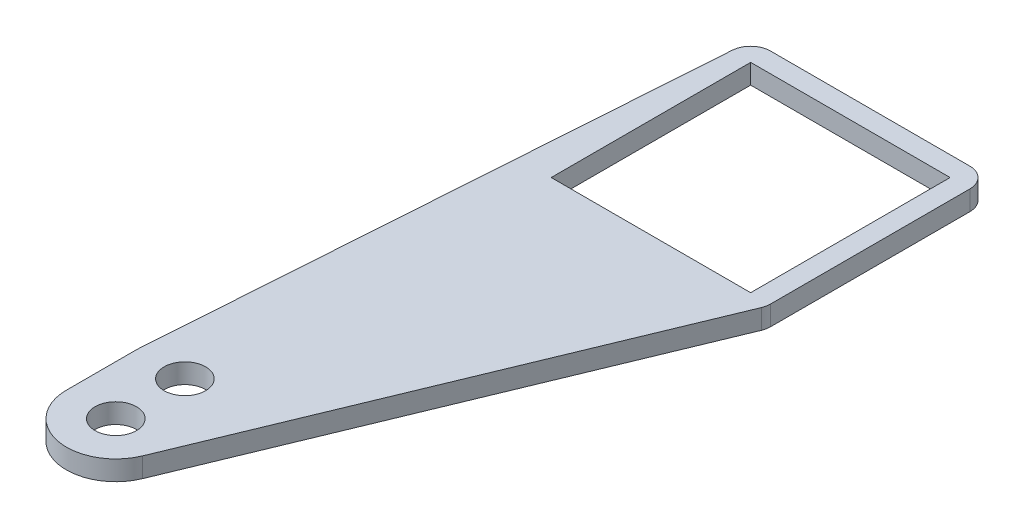
ISO-10303-21;
HEADER;
FILE_DESCRIPTION(('STEP AP214'),'2;1');
FILE_NAME('part.step','',(''),(''),'','','');
FILE_SCHEMA(('AUTOMOTIVE_DESIGN { 1 0 10303 214 1 1 1 1 }'));
ENDSEC;
DATA;
#1=APPLICATION_CONTEXT('core data for automotive mechanical design processes');
#2=APPLICATION_PROTOCOL_DEFINITION('international standard','automotive_design',2000,#1);
#3=PRODUCT_CONTEXT('',#1,'mechanical');
#4=PRODUCT('Part','Part','',(#3));
#5=PRODUCT_RELATED_PRODUCT_CATEGORY('part','',(#4));
#6=PRODUCT_DEFINITION_FORMATION('','',#4);
#7=PRODUCT_DEFINITION_CONTEXT('part definition',#1,'design');
#8=PRODUCT_DEFINITION('design','',#6,#7);
#9=PRODUCT_DEFINITION_SHAPE('','',#8);
#10=(LENGTH_UNIT() NAMED_UNIT(*) SI_UNIT(.MILLI.,.METRE.));
#11=(NAMED_UNIT(*) PLANE_ANGLE_UNIT() SI_UNIT($,.RADIAN.));
#12=(NAMED_UNIT(*) SI_UNIT($,.STERADIAN.) SOLID_ANGLE_UNIT());
#13=UNCERTAINTY_MEASURE_WITH_UNIT(LENGTH_MEASURE(1.E-05),#10,'distance_accuracy_value','');
#14=(GEOMETRIC_REPRESENTATION_CONTEXT(3) GLOBAL_UNCERTAINTY_ASSIGNED_CONTEXT((#13)) GLOBAL_UNIT_ASSIGNED_CONTEXT((#10,
#11,#12)) REPRESENTATION_CONTEXT('',''));
#15=CARTESIAN_POINT('',(0.,0.,0.));
#16=DIRECTION('',(0.,0.,1.));
#17=DIRECTION('',(1.,0.,0.));
#18=AXIS2_PLACEMENT_3D('',#15,#16,#17);
#19=CARTESIAN_POINT('',(-11.0000000000004,-115.999797701156,365.300000000001));
#20=DIRECTION('',(0.,1.,0.));
#21=DIRECTION('',(0.,0.,1.));
#22=AXIS2_PLACEMENT_3D('',#19,#20,#21);
#23=CYLINDRICAL_SURFACE('',#22,5.);
#24=CARTESIAN_POINT('',(-11.0000000000004,-113.999797701156,365.300000000001));
#25=DIRECTION('',(0.,1.,0.));
#26=DIRECTION('',(0.,0.,1.));
#27=AXIS2_PLACEMENT_3D('',#24,#25,#26);
#28=CIRCLE('',#27,5.);
#29=CARTESIAN_POINT('',(-15.9880449573007,-113.999797701156,364.954446091108));
#30=VERTEX_POINT('',#29);
#31=CARTESIAN_POINT('',(-16.0000000000004,-113.999797701156,365.300000000001));
#32=VERTEX_POINT('',#31);
#33=EDGE_CURVE('E220',#30,#32,#28,.T.);
#34=ORIENTED_EDGE('',*,*,#33,.F.);
#35=DIRECTION('',(0.,1.,0.));
#36=VECTOR('',#35,1.);
#37=CARTESIAN_POINT('',(-15.9880449573007,-115.999797701156,364.954446091108));
#38=LINE('',#37,#36);
#39=CARTESIAN_POINT('',(-15.9880449573007,-115.999797701156,364.954446091108));
#40=VERTEX_POINT('',#39);
#41=EDGE_CURVE('E119',#40,#30,#38,.T.);
#42=ORIENTED_EDGE('',*,*,#41,.F.);
#43=CARTESIAN_POINT('',(-11.0000000000004,-115.999797701156,365.300000000001));
#44=DIRECTION('',(0.,1.,0.));
#45=DIRECTION('',(0.,0.,1.));
#46=AXIS2_PLACEMENT_3D('',#43,#44,#45);
#47=CIRCLE('',#46,5.);
#48=CARTESIAN_POINT('',(-16.0000000000004,-115.999797701156,365.300000000001));
#49=VERTEX_POINT('',#48);
#50=EDGE_CURVE('E18',#40,#49,#47,.T.);
#51=ORIENTED_EDGE('',*,*,#50,.T.);
#52=DIRECTION('',(0.,1.,0.));
#53=VECTOR('',#52,1.);
#54=CARTESIAN_POINT('',(-16.0000000000004,-115.999797701156,365.300000000001));
#55=LINE('',#54,#53);
#56=EDGE_CURVE('E118',#32,#49,#55,.F.);
#57=ORIENTED_EDGE('',*,*,#56,.F.);
#58=EDGE_LOOP('',(#34,#42,#51,#57));
#59=FACE_BOUND('',#58,.T.);
#60=ADVANCED_FACE('F15',(#59),#23,.T.);
#61=CARTESIAN_POINT('',(10.0999999999998,-115.999797701156,329.100000000001));
#62=DIRECTION('',(0.,1.,0.));
#63=DIRECTION('',(0.,0.,1.));
#64=AXIS2_PLACEMENT_3D('',#61,#62,#63);
#65=CYLINDRICAL_SURFACE('',#64,2.00000000000003);
#66=CARTESIAN_POINT('',(10.0999999999998,-113.999797701156,329.100000000001));
#67=DIRECTION('',(0.,1.,0.));
#68=DIRECTION('',(0.,0.,1.));
#69=AXIS2_PLACEMENT_3D('',#66,#67,#68);
#70=CIRCLE('',#69,2.00000000000003);
#71=CARTESIAN_POINT('',(11.9483652012207,-113.999797701156,329.863901880425));
#72=VERTEX_POINT('',#71);
#73=CARTESIAN_POINT('',(12.0999999999998,-113.999797701156,329.100000000001));
#74=VERTEX_POINT('',#73);
#75=EDGE_CURVE('E218',#72,#74,#70,.T.);
#76=ORIENTED_EDGE('',*,*,#75,.F.);
#77=DIRECTION('',(0.,1.,0.));
#78=VECTOR('',#77,1.);
#79=CARTESIAN_POINT('',(11.9483647595329,-115.999797701156,329.863902949151));
#80=LINE('',#79,#78);
#81=CARTESIAN_POINT('',(11.9483652012202,-115.999797701156,329.863901880425));
#82=VERTEX_POINT('',#81);
#83=EDGE_CURVE('E178',#82,#72,#80,.T.);
#84=ORIENTED_EDGE('',*,*,#83,.F.);
#85=CARTESIAN_POINT('',(10.0999999999998,-115.999797701156,329.100000000001));
#86=DIRECTION('',(0.,1.,0.));
#87=DIRECTION('',(0.,0.,1.));
#88=AXIS2_PLACEMENT_3D('',#85,#86,#87);
#89=CIRCLE('',#88,2.00000000000003);
#90=CARTESIAN_POINT('',(12.0999999999998,-115.999797701156,329.100000000001));
#91=VERTEX_POINT('',#90);
#92=EDGE_CURVE('E121',#82,#91,#89,.T.);
#93=ORIENTED_EDGE('',*,*,#92,.T.);
#94=DIRECTION('',(0.,1.,0.));
#95=VECTOR('',#94,1.);
#96=CARTESIAN_POINT('',(12.0999999999998,-115.999797701156,329.100000000001));
#97=LINE('',#96,#95);
#98=EDGE_CURVE('E167',#74,#91,#97,.F.);
#99=ORIENTED_EDGE('',*,*,#98,.F.);
#100=EDGE_LOOP('',(#76,#84,#93,#99));
#101=FACE_BOUND('',#100,.T.);
#102=ADVANCED_FACE('F225',(#101),#65,.T.);
#103=CARTESIAN_POINT('',(-1.95000000000032,-113.999797701156,342.100000000001));
#104=DIRECTION('',(0.,1.,0.));
#105=DIRECTION('',(-1.,0.,0.));
#106=AXIS2_PLACEMENT_3D('',#103,#104,#105);
#107=PLANE('',#106);
#108=DIRECTION('',(1.,0.,0.));
#109=VECTOR('',#108,1.);
#110=CARTESIAN_POINT('',(-10.1000000000006,-113.999797701156,308.900000000001));
#111=LINE('',#110,#109);
#112=CARTESIAN_POINT('',(10.0999999999998,-113.999797701156,308.900000000001));
#113=VERTEX_POINT('',#112);
#114=CARTESIAN_POINT('',(-10.1000000000006,-113.999797701156,308.900000000001));
#115=VERTEX_POINT('',#114);
#116=EDGE_CURVE('E162',#113,#115,#111,.F.);
#117=ORIENTED_EDGE('',*,*,#116,.F.);
#118=DIRECTION('',(0.,0.,1.));
#119=VECTOR('',#118,1.);
#120=CARTESIAN_POINT('',(10.0999999999998,-113.999797701156,308.900000000001));
#121=LINE('',#120,#119);
#122=CARTESIAN_POINT('',(10.0999999999998,-113.999797701156,329.100000000001));
#123=VERTEX_POINT('',#122);
#124=EDGE_CURVE('E158',#123,#113,#121,.F.);
#125=ORIENTED_EDGE('',*,*,#124,.F.);
#126=DIRECTION('',(-1.,0.,0.));
#127=VECTOR('',#126,1.);
#128=CARTESIAN_POINT('',(10.0999999999998,-113.999797701156,329.100000000001));
#129=LINE('',#128,#127);
#130=CARTESIAN_POINT('',(-10.1000000000006,-113.999797701156,329.100000000001));
#131=VERTEX_POINT('',#130);
#132=EDGE_CURVE('E151',#131,#123,#129,.F.);
#133=ORIENTED_EDGE('',*,*,#132,.F.);
#134=DIRECTION('',(0.,0.,-1.));
#135=VECTOR('',#134,1.);
#136=CARTESIAN_POINT('',(-10.1000000000006,-113.999797701156,329.100000000001));
#137=LINE('',#136,#135);
#138=EDGE_CURVE('E164',#115,#131,#137,.F.);
#139=ORIENTED_EDGE('',*,*,#138,.F.);
#140=EDGE_LOOP('',(#117,#125,#133,#139));
#141=FACE_BOUND('',#140,.T.);
#142=CARTESIAN_POINT('',(-11.0000000000004,-113.999797701156,365.300000000001));
#143=DIRECTION('',(0.,1.,0.));
#144=DIRECTION('',(0.,0.,1.));
#145=AXIS2_PLACEMENT_3D('',#142,#143,#144);
#146=CIRCLE('',#145,2.09999999999999);
#147=CARTESIAN_POINT('',(-11.0000000000004,-113.999797701156,367.400000000001));
#148=VERTEX_POINT('',#147);
#149=EDGE_CURVE('E166',#148,#148,#146,.F.);
#150=ORIENTED_EDGE('',*,*,#149,.T.);
#151=EDGE_LOOP('',(#150));
#152=FACE_BOUND('',#151,.T.);
#153=CARTESIAN_POINT('',(-11.0000000000004,-113.999797701156,372.300000000001));
#154=DIRECTION('',(0.,1.,0.));
#155=DIRECTION('',(0.,0.,1.));
#156=AXIS2_PLACEMENT_3D('',#153,#154,#155);
#157=CIRCLE('',#156,2.09999999999998);
#158=CARTESIAN_POINT('',(-11.0000000000004,-113.999797701156,374.400000000001));
#159=VERTEX_POINT('',#158);
#160=EDGE_CURVE('E170',#159,#159,#157,.F.);
#161=ORIENTED_EDGE('',*,*,#160,.T.);
#162=EDGE_LOOP('',(#161));
#163=FACE_BOUND('',#162,.T.);
#164=DIRECTION('',(0.381950405849297,0.,-0.924182821454477));
#165=VECTOR('',#164,1.);
#166=CARTESIAN_POINT('',(-6.37908589272803,-113.999797701156,374.209752029247));
#167=LINE('',#166,#165);
#168=CARTESIAN_POINT('',(-6.37908589272811,-113.999797701156,374.209752029247));
#169=VERTEX_POINT('',#168);
#170=EDGE_CURVE('E177',#72,#169,#167,.F.);
#171=ORIENTED_EDGE('',*,*,#170,.F.);
#172=ORIENTED_EDGE('',*,*,#75,.T.);
#173=DIRECTION('',(0.,0.,-1.));
#174=VECTOR('',#173,1.);
#175=CARTESIAN_POINT('',(12.0999999999998,-113.999797701156,329.100000000001));
#176=LINE('',#175,#174);
#177=CARTESIAN_POINT('',(12.0999999999998,-113.999797701156,308.900000000001));
#178=VERTEX_POINT('',#177);
#179=EDGE_CURVE('E171',#178,#74,#176,.F.);
#180=ORIENTED_EDGE('',*,*,#179,.F.);
#181=CARTESIAN_POINT('',(10.0999999999998,-113.999797701156,308.900000000001));
#182=DIRECTION('',(0.,1.,0.));
#183=DIRECTION('',(0.,0.,1.));
#184=AXIS2_PLACEMENT_3D('',#181,#182,#183);
#185=CIRCLE('',#184,1.99999999999999);
#186=CARTESIAN_POINT('',(10.0999999999998,-113.999797701156,306.900000000001));
#187=VERTEX_POINT('',#186);
#188=EDGE_CURVE('E198',#187,#178,#185,.F.);
#189=ORIENTED_EDGE('',*,*,#188,.F.);
#190=DIRECTION('',(-1.,0.,0.));
#191=VECTOR('',#190,1.);
#192=CARTESIAN_POINT('',(10.0999999999998,-113.999797701156,306.900000000001));
#193=LINE('',#192,#191);
#194=CARTESIAN_POINT('',(-10.1000000000007,-113.999797701156,306.900000000001));
#195=VERTEX_POINT('',#194);
#196=EDGE_CURVE('E191',#195,#187,#193,.F.);
#197=ORIENTED_EDGE('',*,*,#196,.F.);
#198=CARTESIAN_POINT('',(-10.1000000000006,-113.999797701156,308.900000000001));
#199=DIRECTION('',(0.,1.,0.));
#200=DIRECTION('',(0.,0.,1.));
#201=AXIS2_PLACEMENT_3D('',#198,#199,#200);
#202=CIRCLE('',#201,2.00000000000008);
#203=CARTESIAN_POINT('',(-12.0952179829208,-113.999797701156,308.761778436444));
#204=VERTEX_POINT('',#203);
#205=EDGE_CURVE('E188',#204,#195,#202,.F.);
#206=ORIENTED_EDGE('',*,*,#205,.F.);
#207=DIRECTION('',(-0.0691107817786133,0.,0.997608991460055));
#208=VECTOR('',#207,1.);
#209=CARTESIAN_POINT('',(-12.0952179829208,-113.999797701156,308.761778436444));
#210=LINE('',#209,#208);
#211=EDGE_CURVE('E184',#30,#204,#210,.F.);
#212=ORIENTED_EDGE('',*,*,#211,.F.);
#213=ORIENTED_EDGE('',*,*,#33,.T.);
#214=DIRECTION('',(0.,0.,1.));
#215=VECTOR('',#214,1.);
#216=CARTESIAN_POINT('',(-16.0000000000004,-113.999797701156,365.300000000001));
#217=LINE('',#216,#215);
#218=CARTESIAN_POINT('',(-16.0000000000004,-113.999797701156,372.300000000001));
#219=VERTEX_POINT('',#218);
#220=EDGE_CURVE('E129',#219,#32,#217,.F.);
#221=ORIENTED_EDGE('',*,*,#220,.F.);
#222=CARTESIAN_POINT('',(-11.0000000000004,-113.999797701156,372.300000000001));
#223=DIRECTION('',(0.,1.,0.));
#224=DIRECTION('',(0.,0.,1.));
#225=AXIS2_PLACEMENT_3D('',#222,#223,#224);
#226=CIRCLE('',#225,5.00000000000002);
#227=EDGE_CURVE('E130',#169,#219,#226,.F.);
#228=ORIENTED_EDGE('',*,*,#227,.F.);
#229=EDGE_LOOP('',(#171,#172,#180,#189,#197,#206,#212,#213,#221,#228));
#230=FACE_BOUND('',#229,.T.);
#231=ADVANCED_FACE('F308',(#141,#152,#163,#230),#107,.T.);
#232=CARTESIAN_POINT('',(10.0999999999998,-115.999797701156,308.900000000001));
#233=DIRECTION('',(0.,1.,0.));
#234=DIRECTION('',(0.,0.,1.));
#235=AXIS2_PLACEMENT_3D('',#232,#233,#234);
#236=CYLINDRICAL_SURFACE('',#235,1.99999999999999);
#237=ORIENTED_EDGE('',*,*,#188,.T.);
#238=DIRECTION('',(0.,1.,0.));
#239=VECTOR('',#238,1.);
#240=CARTESIAN_POINT('',(12.0999999999998,-115.999797701156,308.900000000001));
#241=LINE('',#240,#239);
#242=CARTESIAN_POINT('',(12.0999999999998,-115.999797701156,308.900000000001));
#243=VERTEX_POINT('',#242);
#244=EDGE_CURVE('E172',#243,#178,#241,.T.);
#245=ORIENTED_EDGE('',*,*,#244,.F.);
#246=CARTESIAN_POINT('',(10.0999999999998,-115.999797701156,308.900000000001));
#247=DIRECTION('',(0.,1.,0.));
#248=DIRECTION('',(0.,0.,1.));
#249=AXIS2_PLACEMENT_3D('',#246,#247,#248);
#250=CIRCLE('',#249,1.99999999999999);
#251=CARTESIAN_POINT('',(10.0999999999998,-115.999797701156,306.900000000001));
#252=VERTEX_POINT('',#251);
#253=EDGE_CURVE('E149',#243,#252,#250,.T.);
#254=ORIENTED_EDGE('',*,*,#253,.T.);
#255=DIRECTION('',(0.,1.,0.));
#256=VECTOR('',#255,1.);
#257=CARTESIAN_POINT('',(10.0999999999998,-115.999797701156,306.900000000001));
#258=LINE('',#257,#256);
#259=EDGE_CURVE('E189',#187,#252,#258,.F.);
#260=ORIENTED_EDGE('',*,*,#259,.F.);
#261=EDGE_LOOP('',(#237,#245,#254,#260));
#262=FACE_BOUND('',#261,.T.);
#263=ADVANCED_FACE('F304',(#262),#236,.T.);
#264=CARTESIAN_POINT('',(10.0999999999998,-115.999797701156,306.900000000001));
#265=DIRECTION('',(0.,0.,-1.));
#266=DIRECTION('',(-1.,0.,0.));
#267=AXIS2_PLACEMENT_3D('',#264,#265,#266);
#268=PLANE('',#267);
#269=ORIENTED_EDGE('',*,*,#196,.T.);
#270=ORIENTED_EDGE('',*,*,#259,.T.);
#271=DIRECTION('',(-1.,0.,0.));
#272=VECTOR('',#271,1.);
#273=CARTESIAN_POINT('',(-1.95000000000032,-115.999797701156,306.900000000001));
#274=LINE('',#273,#272);
#275=CARTESIAN_POINT('',(-10.1000000000006,-115.999797701156,306.900000000001));
#276=VERTEX_POINT('',#275);
#277=EDGE_CURVE('E146',#252,#276,#274,.T.);
#278=ORIENTED_EDGE('',*,*,#277,.T.);
#279=DIRECTION('',(0.,1.,0.));
#280=VECTOR('',#279,1.);
#281=CARTESIAN_POINT('',(-10.1000000000007,-115.999797701156,306.900000000001));
#282=LINE('',#281,#280);
#283=EDGE_CURVE('E186',#195,#276,#282,.F.);
#284=ORIENTED_EDGE('',*,*,#283,.F.);
#285=EDGE_LOOP('',(#269,#270,#278,#284));
#286=FACE_BOUND('',#285,.T.);
#287=ADVANCED_FACE('F300',(#286),#268,.T.);
#288=CARTESIAN_POINT('',(-10.1000000000006,-115.999797701156,308.900000000001));
#289=DIRECTION('',(0.,1.,0.));
#290=DIRECTION('',(0.,0.,1.));
#291=AXIS2_PLACEMENT_3D('',#288,#289,#290);
#292=CYLINDRICAL_SURFACE('',#291,2.00000000000008);
#293=ORIENTED_EDGE('',*,*,#205,.T.);
#294=ORIENTED_EDGE('',*,*,#283,.T.);
#295=CARTESIAN_POINT('',(-10.1000000000006,-115.999797701156,308.900000000001));
#296=DIRECTION('',(0.,1.,0.));
#297=DIRECTION('',(0.,0.,1.));
#298=AXIS2_PLACEMENT_3D('',#295,#296,#297);
#299=CIRCLE('',#298,2.00000000000008);
#300=CARTESIAN_POINT('',(-12.0952179829208,-115.999797701156,308.761778436444));
#301=VERTEX_POINT('',#300);
#302=EDGE_CURVE('E141',#276,#301,#299,.T.);
#303=ORIENTED_EDGE('',*,*,#302,.T.);
#304=DIRECTION('',(0.,1.,0.));
#305=VECTOR('',#304,1.);
#306=CARTESIAN_POINT('',(-12.0952179829208,-115.999797701156,308.761778436444));
#307=LINE('',#306,#305);
#308=EDGE_CURVE('E182',#204,#301,#307,.F.);
#309=ORIENTED_EDGE('',*,*,#308,.F.);
#310=EDGE_LOOP('',(#293,#294,#303,#309));
#311=FACE_BOUND('',#310,.T.);
#312=ADVANCED_FACE('F296',(#311),#292,.T.);
#313=CARTESIAN_POINT('',(-12.0952179829208,-115.999797701156,308.761778436444));
#314=DIRECTION('',(-0.997608991460055,0.,-0.0691107817786133));
#315=DIRECTION('',(-0.0691107817786133,0.,0.997608991460055));
#316=AXIS2_PLACEMENT_3D('',#313,#314,#315);
#317=PLANE('',#316);
#318=ORIENTED_EDGE('',*,*,#211,.T.);
#319=ORIENTED_EDGE('',*,*,#308,.T.);
#320=DIRECTION('',(-0.0691107817786133,0.,0.997608991460055));
#321=VECTOR('',#320,1.);
#322=CARTESIAN_POINT('',(-12.0952179829208,-115.999797701156,308.761778436444));
#323=LINE('',#322,#321);
#324=EDGE_CURVE('E137',#301,#40,#323,.T.);
#325=ORIENTED_EDGE('',*,*,#324,.T.);
#326=ORIENTED_EDGE('',*,*,#41,.T.);
#327=EDGE_LOOP('',(#318,#319,#325,#326));
#328=FACE_BOUND('',#327,.T.);
#329=ADVANCED_FACE('F293',(#328),#317,.T.);
#330=CARTESIAN_POINT('',(-16.0000000000004,-115.999797701156,365.300000000001));
#331=DIRECTION('',(-1.,0.,0.));
#332=DIRECTION('',(0.,0.,1.));
#333=AXIS2_PLACEMENT_3D('',#330,#331,#332);
#334=PLANE('',#333);
#335=ORIENTED_EDGE('',*,*,#220,.T.);
#336=ORIENTED_EDGE('',*,*,#56,.T.);
#337=DIRECTION('',(0.,0.,1.));
#338=VECTOR('',#337,1.);
#339=CARTESIAN_POINT('',(-16.0000000000004,-115.999797701156,342.100000000001));
#340=LINE('',#339,#338);
#341=CARTESIAN_POINT('',(-16.0000000000004,-115.999797701156,372.300000000001));
#342=VERTEX_POINT('',#341);
#343=EDGE_CURVE('E127',#49,#342,#340,.T.);
#344=ORIENTED_EDGE('',*,*,#343,.T.);
#345=DIRECTION('',(0.,1.,0.));
#346=VECTOR('',#345,1.);
#347=CARTESIAN_POINT('',(-16.0000000000004,-115.999797701156,372.300000000001));
#348=LINE('',#347,#346);
#349=EDGE_CURVE('E180',#219,#342,#348,.F.);
#350=ORIENTED_EDGE('',*,*,#349,.F.);
#351=EDGE_LOOP('',(#335,#336,#344,#350));
#352=FACE_BOUND('',#351,.T.);
#353=ADVANCED_FACE('F125',(#352),#334,.T.);
#354=CARTESIAN_POINT('',(-11.0000000000004,-115.999797701156,372.300000000001));
#355=DIRECTION('',(0.,1.,0.));
#356=DIRECTION('',(0.,0.,1.));
#357=AXIS2_PLACEMENT_3D('',#354,#355,#356);
#358=CYLINDRICAL_SURFACE('',#357,5.00000000000002);
#359=ORIENTED_EDGE('',*,*,#227,.T.);
#360=ORIENTED_EDGE('',*,*,#349,.T.);
#361=CARTESIAN_POINT('',(-11.0000000000004,-115.999797701156,372.300000000001));
#362=DIRECTION('',(0.,1.,0.));
#363=DIRECTION('',(0.,0.,1.));
#364=AXIS2_PLACEMENT_3D('',#361,#362,#363);
#365=CIRCLE('',#364,5.00000000000002);
#366=CARTESIAN_POINT('',(-6.37908589272807,-115.999797701156,374.209752029247));
#367=VERTEX_POINT('',#366);
#368=EDGE_CURVE('E136',#342,#367,#365,.T.);
#369=ORIENTED_EDGE('',*,*,#368,.T.);
#370=DIRECTION('',(0.,1.,0.));
#371=VECTOR('',#370,1.);
#372=CARTESIAN_POINT('',(-6.37908589272803,-115.999797701156,374.209752029247));
#373=LINE('',#372,#371);
#374=EDGE_CURVE('E175',#169,#367,#373,.F.);
#375=ORIENTED_EDGE('',*,*,#374,.F.);
#376=EDGE_LOOP('',(#359,#360,#369,#375));
#377=FACE_BOUND('',#376,.T.);
#378=ADVANCED_FACE('F286',(#377),#358,.T.);
#379=CARTESIAN_POINT('',(-6.37908589272803,-115.999797701156,374.209752029247));
#380=DIRECTION('',(0.924182821454477,0.,0.381950405849297));
#381=DIRECTION('',(0.381950405849297,0.,-0.924182821454477));
#382=AXIS2_PLACEMENT_3D('',#379,#380,#381);
#383=PLANE('',#382);
#384=ORIENTED_EDGE('',*,*,#170,.T.);
#385=ORIENTED_EDGE('',*,*,#374,.T.);
#386=DIRECTION('',(0.381950405849276,0.,-0.924182821454486));
#387=VECTOR('',#386,1.);
#388=CARTESIAN_POINT('',(-6.37908589272801,-115.999797701156,374.209752029247));
#389=LINE('',#388,#387);
#390=EDGE_CURVE('E139',#367,#82,#389,.T.);
#391=ORIENTED_EDGE('',*,*,#390,.T.);
#392=ORIENTED_EDGE('',*,*,#83,.T.);
#393=EDGE_LOOP('',(#384,#385,#391,#392));
#394=FACE_BOUND('',#393,.T.);
#395=ADVANCED_FACE('F283',(#394),#383,.T.);
#396=CARTESIAN_POINT('',(12.0999999999998,-115.999797701156,329.100000000001));
#397=DIRECTION('',(1.,0.,0.));
#398=DIRECTION('',(0.,0.,-1.));
#399=AXIS2_PLACEMENT_3D('',#396,#397,#398);
#400=PLANE('',#399);
#401=ORIENTED_EDGE('',*,*,#179,.T.);
#402=ORIENTED_EDGE('',*,*,#98,.T.);
#403=DIRECTION('',(0.,0.,1.));
#404=VECTOR('',#403,1.);
#405=CARTESIAN_POINT('',(12.0999999999998,-115.999797701156,342.100000000001));
#406=LINE('',#405,#404);
#407=EDGE_CURVE('E205',#91,#243,#406,.F.);
#408=ORIENTED_EDGE('',*,*,#407,.T.);
#409=ORIENTED_EDGE('',*,*,#244,.T.);
#410=EDGE_LOOP('',(#401,#402,#408,#409));
#411=FACE_BOUND('',#410,.T.);
#412=ADVANCED_FACE('F230',(#411),#400,.T.);
#413=CARTESIAN_POINT('',(-11.0000000000004,-115.999797701156,372.300000000001));
#414=DIRECTION('',(0.,1.,0.));
#415=DIRECTION('',(0.,0.,1.));
#416=AXIS2_PLACEMENT_3D('',#413,#414,#415);
#417=CYLINDRICAL_SURFACE('',#416,2.09999999999998);
#418=CARTESIAN_POINT('',(-11.0000000000004,-115.999797701156,372.300000000001));
#419=DIRECTION('',(0.,1.,0.));
#420=DIRECTION('',(0.,0.,1.));
#421=AXIS2_PLACEMENT_3D('',#418,#419,#420);
#422=CIRCLE('',#421,2.09999999999998);
#423=CARTESIAN_POINT('',(-11.0000000000004,-115.999797701156,374.400000000001));
#424=VERTEX_POINT('',#423);
#425=EDGE_CURVE('E203',#424,#424,#422,.F.);
#426=ORIENTED_EDGE('',*,*,#425,.T.);
#427=EDGE_LOOP('',(#426));
#428=FACE_BOUND('',#427,.T.);
#429=ORIENTED_EDGE('',*,*,#160,.F.);
#430=EDGE_LOOP('',(#429));
#431=FACE_BOUND('',#430,.T.);
#432=ADVANCED_FACE('F276',(#428,#431),#417,.F.);
#433=CARTESIAN_POINT('',(-11.0000000000004,-115.999797701156,365.300000000001));
#434=DIRECTION('',(0.,1.,0.));
#435=DIRECTION('',(0.,0.,1.));
#436=AXIS2_PLACEMENT_3D('',#433,#434,#435);
#437=CYLINDRICAL_SURFACE('',#436,2.09999999999999);
#438=CARTESIAN_POINT('',(-11.0000000000004,-115.999797701156,365.300000000001));
#439=DIRECTION('',(0.,1.,0.));
#440=DIRECTION('',(0.,0.,1.));
#441=AXIS2_PLACEMENT_3D('',#438,#439,#440);
#442=CIRCLE('',#441,2.09999999999999);
#443=CARTESIAN_POINT('',(-11.0000000000004,-115.999797701156,367.400000000001));
#444=VERTEX_POINT('',#443);
#445=EDGE_CURVE('E199',#444,#444,#442,.F.);
#446=ORIENTED_EDGE('',*,*,#445,.T.);
#447=EDGE_LOOP('',(#446));
#448=FACE_BOUND('',#447,.T.);
#449=ORIENTED_EDGE('',*,*,#149,.F.);
#450=EDGE_LOOP('',(#449));
#451=FACE_BOUND('',#450,.T.);
#452=ADVANCED_FACE('F273',(#448,#451),#437,.F.);
#453=CARTESIAN_POINT('',(-10.1000000000006,-115.999797701156,329.100000000001));
#454=DIRECTION('',(1.,0.,0.));
#455=DIRECTION('',(0.,0.,-1.));
#456=AXIS2_PLACEMENT_3D('',#453,#454,#455);
#457=PLANE('',#456);
#458=ORIENTED_EDGE('',*,*,#138,.T.);
#459=DIRECTION('',(0.,1.,0.));
#460=VECTOR('',#459,1.);
#461=CARTESIAN_POINT('',(-10.1000000000006,-115.999797701156,329.100000000001));
#462=LINE('',#461,#460);
#463=CARTESIAN_POINT('',(-10.1000000000006,-115.999797701156,329.100000000001));
#464=VERTEX_POINT('',#463);
#465=EDGE_CURVE('E153',#464,#131,#462,.T.);
#466=ORIENTED_EDGE('',*,*,#465,.F.);
#467=DIRECTION('',(0.,0.,1.));
#468=VECTOR('',#467,1.);
#469=CARTESIAN_POINT('',(-10.1000000000006,-115.999797701156,342.100000000001));
#470=LINE('',#469,#468);
#471=CARTESIAN_POINT('',(-10.1000000000006,-115.999797701156,308.900000000001));
#472=VERTEX_POINT('',#471);
#473=EDGE_CURVE('E202',#464,#472,#470,.F.);
#474=ORIENTED_EDGE('',*,*,#473,.T.);
#475=DIRECTION('',(0.,1.,0.));
#476=VECTOR('',#475,1.);
#477=CARTESIAN_POINT('',(-10.1000000000006,-115.999797701156,308.900000000001));
#478=LINE('',#477,#476);
#479=EDGE_CURVE('E160',#115,#472,#478,.F.);
#480=ORIENTED_EDGE('',*,*,#479,.F.);
#481=EDGE_LOOP('',(#458,#466,#474,#480));
#482=FACE_BOUND('',#481,.T.);
#483=ADVANCED_FACE('F254',(#482),#457,.T.);
#484=CARTESIAN_POINT('',(-10.1000000000006,-115.999797701156,308.900000000001));
#485=DIRECTION('',(0.,0.,1.));
#486=DIRECTION('',(1.,0.,0.));
#487=AXIS2_PLACEMENT_3D('',#484,#485,#486);
#488=PLANE('',#487);
#489=ORIENTED_EDGE('',*,*,#116,.T.);
#490=ORIENTED_EDGE('',*,*,#479,.T.);
#491=DIRECTION('',(-1.,0.,0.));
#492=VECTOR('',#491,1.);
#493=CARTESIAN_POINT('',(-1.95000000000032,-115.999797701156,308.900000000001));
#494=LINE('',#493,#492);
#495=CARTESIAN_POINT('',(10.0999999999998,-115.999797701156,308.900000000001));
#496=VERTEX_POINT('',#495);
#497=EDGE_CURVE('E237',#472,#496,#494,.F.);
#498=ORIENTED_EDGE('',*,*,#497,.T.);
#499=DIRECTION('',(0.,1.,0.));
#500=VECTOR('',#499,1.);
#501=CARTESIAN_POINT('',(10.0999999999998,-115.999797701156,308.900000000001));
#502=LINE('',#501,#500);
#503=EDGE_CURVE('E156',#113,#496,#502,.F.);
#504=ORIENTED_EDGE('',*,*,#503,.F.);
#505=EDGE_LOOP('',(#489,#490,#498,#504));
#506=FACE_BOUND('',#505,.T.);
#507=ADVANCED_FACE('F249',(#506),#488,.T.);
#508=CARTESIAN_POINT('',(10.0999999999998,-115.999797701156,308.900000000001));
#509=DIRECTION('',(-1.,0.,0.));
#510=DIRECTION('',(0.,0.,1.));
#511=AXIS2_PLACEMENT_3D('',#508,#509,#510);
#512=PLANE('',#511);
#513=ORIENTED_EDGE('',*,*,#124,.T.);
#514=ORIENTED_EDGE('',*,*,#503,.T.);
#515=DIRECTION('',(0.,0.,1.));
#516=VECTOR('',#515,1.);
#517=CARTESIAN_POINT('',(10.0999999999998,-115.999797701156,342.100000000001));
#518=LINE('',#517,#516);
#519=CARTESIAN_POINT('',(10.0999999999998,-115.999797701156,329.100000000001));
#520=VERTEX_POINT('',#519);
#521=EDGE_CURVE('E24',#496,#520,#518,.T.);
#522=ORIENTED_EDGE('',*,*,#521,.T.);
#523=DIRECTION('',(0.,1.,0.));
#524=VECTOR('',#523,1.);
#525=CARTESIAN_POINT('',(10.0999999999998,-115.999797701156,329.100000000001));
#526=LINE('',#525,#524);
#527=EDGE_CURVE('E32',#123,#520,#526,.F.);
#528=ORIENTED_EDGE('',*,*,#527,.F.);
#529=EDGE_LOOP('',(#513,#514,#522,#528));
#530=FACE_BOUND('',#529,.T.);
#531=ADVANCED_FACE('F243',(#530),#512,.T.);
#532=CARTESIAN_POINT('',(10.0999999999998,-115.999797701156,329.100000000001));
#533=DIRECTION('',(0.,0.,-1.));
#534=DIRECTION('',(-1.,0.,0.));
#535=AXIS2_PLACEMENT_3D('',#532,#533,#534);
#536=PLANE('',#535);
#537=ORIENTED_EDGE('',*,*,#132,.T.);
#538=ORIENTED_EDGE('',*,*,#527,.T.);
#539=DIRECTION('',(-1.,0.,0.));
#540=VECTOR('',#539,1.);
#541=CARTESIAN_POINT('',(-1.95000000000032,-115.999797701156,329.100000000001));
#542=LINE('',#541,#540);
#543=EDGE_CURVE('E9',#520,#464,#542,.T.);
#544=ORIENTED_EDGE('',*,*,#543,.T.);
#545=ORIENTED_EDGE('',*,*,#465,.T.);
#546=EDGE_LOOP('',(#537,#538,#544,#545));
#547=FACE_BOUND('',#546,.T.);
#548=ADVANCED_FACE('F257',(#547),#536,.T.);
#549=CARTESIAN_POINT('',(-1.95000000000032,-115.999797701156,342.100000000001));
#550=DIRECTION('',(0.,1.,0.));
#551=DIRECTION('',(-1.,0.,0.));
#552=AXIS2_PLACEMENT_3D('',#549,#550,#551);
#553=PLANE('',#552);
#554=ORIENTED_EDGE('',*,*,#521,.F.);
#555=ORIENTED_EDGE('',*,*,#497,.F.);
#556=ORIENTED_EDGE('',*,*,#473,.F.);
#557=ORIENTED_EDGE('',*,*,#543,.F.);
#558=EDGE_LOOP('',(#554,#555,#556,#557));
#559=FACE_BOUND('',#558,.T.);
#560=ORIENTED_EDGE('',*,*,#445,.F.);
#561=EDGE_LOOP('',(#560));
#562=FACE_BOUND('',#561,.T.);
#563=ORIENTED_EDGE('',*,*,#425,.F.);
#564=EDGE_LOOP('',(#563));
#565=FACE_BOUND('',#564,.T.);
#566=ORIENTED_EDGE('',*,*,#92,.F.);
#567=ORIENTED_EDGE('',*,*,#390,.F.);
#568=ORIENTED_EDGE('',*,*,#368,.F.);
#569=ORIENTED_EDGE('',*,*,#343,.F.);
#570=ORIENTED_EDGE('',*,*,#50,.F.);
#571=ORIENTED_EDGE('',*,*,#324,.F.);
#572=ORIENTED_EDGE('',*,*,#302,.F.);
#573=ORIENTED_EDGE('',*,*,#277,.F.);
#574=ORIENTED_EDGE('',*,*,#253,.F.);
#575=ORIENTED_EDGE('',*,*,#407,.F.);
#576=EDGE_LOOP('',(#566,#567,#568,#569,#570,#571,#572,#573,#574,#575));
#577=FACE_BOUND('',#576,.T.);
#578=ADVANCED_FACE('F133',(#559,#562,#565,#577),#553,.F.);
#579=CLOSED_SHELL('',(#60,#102,#231,#263,#287,#312,#329,#353,#378,#395,#412,#432,#452,#483,#507,
#531,#548,#578));
#580=MANIFOLD_SOLID_BREP('B1',#579);
#581=ADVANCED_BREP_SHAPE_REPRESENTATION('',(#18,#580),#14);
#582=SHAPE_DEFINITION_REPRESENTATION(#9,#581);
ENDSEC;
END-ISO-10303-21;
